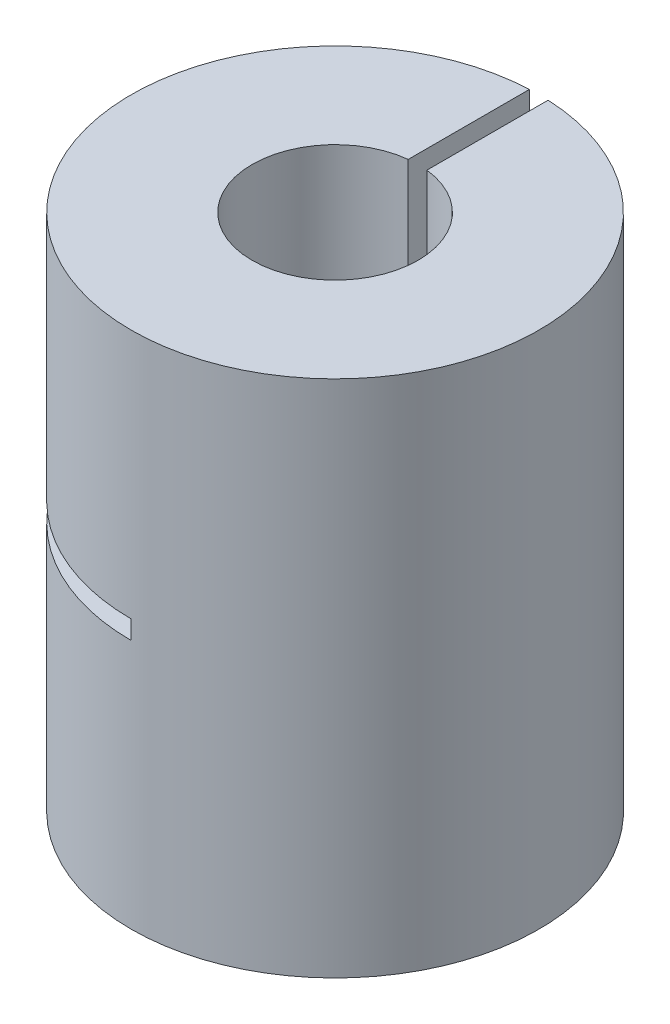
ISO-10303-21;
HEADER;
FILE_DESCRIPTION(('STEP AP214'),'2;1');
FILE_NAME('part.step','',(''),(''),'','','');
FILE_SCHEMA(('AUTOMOTIVE_DESIGN { 1 0 10303 214 1 1 1 1 }'));
ENDSEC;
DATA;
#1=APPLICATION_CONTEXT('core data for automotive mechanical design processes');
#2=APPLICATION_PROTOCOL_DEFINITION('international standard','automotive_design',2000,#1);
#3=PRODUCT_CONTEXT('',#1,'mechanical');
#4=PRODUCT('Part','Part','',(#3));
#5=PRODUCT_RELATED_PRODUCT_CATEGORY('part','',(#4));
#6=PRODUCT_DEFINITION_FORMATION('','',#4);
#7=PRODUCT_DEFINITION_CONTEXT('part definition',#1,'design');
#8=PRODUCT_DEFINITION('design','',#6,#7);
#9=PRODUCT_DEFINITION_SHAPE('','',#8);
#10=(LENGTH_UNIT() NAMED_UNIT(*) SI_UNIT(.MILLI.,.METRE.));
#11=(NAMED_UNIT(*) PLANE_ANGLE_UNIT() SI_UNIT($,.RADIAN.));
#12=(NAMED_UNIT(*) SI_UNIT($,.STERADIAN.) SOLID_ANGLE_UNIT());
#13=UNCERTAINTY_MEASURE_WITH_UNIT(LENGTH_MEASURE(1.E-05),#10,'distance_accuracy_value','');
#14=(GEOMETRIC_REPRESENTATION_CONTEXT(3) GLOBAL_UNCERTAINTY_ASSIGNED_CONTEXT((#13)) GLOBAL_UNIT_ASSIGNED_CONTEXT((#10,
#11,#12)) REPRESENTATION_CONTEXT('',''));
#15=CARTESIAN_POINT('',(0.,0.,0.));
#16=DIRECTION('',(0.,0.,1.));
#17=DIRECTION('',(1.,0.,0.));
#18=AXIS2_PLACEMENT_3D('',#15,#16,#17);
#19=CARTESIAN_POINT('',(0.,25.,0.));
#20=DIRECTION('',(0.,-1.,0.));
#21=DIRECTION('',(0.,0.,-1.));
#22=AXIS2_PLACEMENT_3D('',#19,#20,#21);
#23=CYLINDRICAL_SURFACE('',#22,9.825);
#24=CARTESIAN_POINT('',(0.,25.,0.));
#25=DIRECTION('',(0.,1.,0.));
#26=DIRECTION('',(0.,0.,1.));
#27=AXIS2_PLACEMENT_3D('',#24,#25,#26);
#28=CIRCLE('',#27,9.825);
#29=CARTESIAN_POINT('',(-0.450000000000001,25.,-9.8146892462268));
#30=VERTEX_POINT('',#29);
#31=CARTESIAN_POINT('',(0.450000000000001,25.,-9.8146892462268));
#32=VERTEX_POINT('',#31);
#33=EDGE_CURVE('E127',#30,#32,#28,.T.);
#34=ORIENTED_EDGE('',*,*,#33,.F.);
#35=DIRECTION('',(0.,-1.,0.));
#36=VECTOR('',#35,1.);
#37=CARTESIAN_POINT('',(-0.450000000000001,25.,-9.8146892462268));
#38=LINE('',#37,#36);
#39=CARTESIAN_POINT('',(-0.450000000000001,12.95,-9.8146892462268));
#40=VERTEX_POINT('',#39);
#41=EDGE_CURVE('E110',#30,#40,#38,.T.);
#42=ORIENTED_EDGE('',*,*,#41,.T.);
#43=CARTESIAN_POINT('',(0.,12.95,0.));
#44=DIRECTION('',(0.,1.,0.));
#45=DIRECTION('',(0.,0.,1.));
#46=AXIS2_PLACEMENT_3D('',#43,#44,#45);
#47=CIRCLE('',#46,9.825);
#48=CARTESIAN_POINT('',(0.,12.95,9.825));
#49=VERTEX_POINT('',#48);
#50=EDGE_CURVE('E158',#40,#49,#47,.T.);
#51=ORIENTED_EDGE('',*,*,#50,.T.);
#52=DIRECTION('',(0.,-1.,0.));
#53=VECTOR('',#52,1.);
#54=CARTESIAN_POINT('',(0.,25.,9.825));
#55=LINE('',#54,#53);
#56=CARTESIAN_POINT('',(0.,12.05,9.825));
#57=VERTEX_POINT('',#56);
#58=EDGE_CURVE('E178',#57,#49,#55,.F.);
#59=ORIENTED_EDGE('',*,*,#58,.F.);
#60=CARTESIAN_POINT('',(0.,12.05,0.));
#61=DIRECTION('',(0.,1.,0.));
#62=DIRECTION('',(0.,0.,1.));
#63=AXIS2_PLACEMENT_3D('',#60,#61,#62);
#64=CIRCLE('',#63,9.825);
#65=CARTESIAN_POINT('',(-0.450000000000001,12.05,-9.8146892462268));
#66=VERTEX_POINT('',#65);
#67=EDGE_CURVE('E176',#66,#57,#64,.T.);
#68=ORIENTED_EDGE('',*,*,#67,.F.);
#69=CARTESIAN_POINT('',(-0.45,0.,-9.8146892462268));
#70=VERTEX_POINT('',#69);
#71=EDGE_CURVE('E57',#66,#70,#38,.T.);
#72=ORIENTED_EDGE('',*,*,#71,.T.);
#73=CARTESIAN_POINT('',(0.,0.,0.));
#74=DIRECTION('',(0.,1.,0.));
#75=DIRECTION('',(0.,0.,1.));
#76=AXIS2_PLACEMENT_3D('',#73,#74,#75);
#77=CIRCLE('',#76,9.825);
#78=CARTESIAN_POINT('',(0.45,0.,-9.8146892462268));
#79=VERTEX_POINT('',#78);
#80=EDGE_CURVE('E137',#70,#79,#77,.T.);
#81=ORIENTED_EDGE('',*,*,#80,.T.);
#82=DIRECTION('',(0.,-1.,0.));
#83=VECTOR('',#82,1.);
#84=CARTESIAN_POINT('',(0.450000000000001,25.,-9.8146892462268));
#85=LINE('',#84,#83);
#86=EDGE_CURVE('E135',#79,#32,#85,.F.);
#87=ORIENTED_EDGE('',*,*,#86,.T.);
#88=EDGE_LOOP('',(#34,#42,#51,#59,#68,#72,#81,#87));
#89=FACE_BOUND('',#88,.T.);
#90=ADVANCED_FACE('F36',(#89),#23,.T.);
#91=CARTESIAN_POINT('',(0.,11.5,0.));
#92=DIRECTION('',(0.,1.,0.));
#93=DIRECTION('',(0.,0.,1.));
#94=AXIS2_PLACEMENT_3D('',#91,#92,#93);
#95=CYLINDRICAL_SURFACE('',#94,4.);
#96=CARTESIAN_POINT('',(0.,11.5,0.));
#97=DIRECTION('',(0.,1.,0.));
#98=DIRECTION('',(0.,0.,1.));
#99=AXIS2_PLACEMENT_3D('',#96,#97,#98);
#100=CIRCLE('',#99,4.);
#101=CARTESIAN_POINT('',(-0.45,11.5,-3.97460689880144));
#102=VERTEX_POINT('',#101);
#103=CARTESIAN_POINT('',(0.45,11.5,-3.97460689880144));
#104=VERTEX_POINT('',#103);
#105=EDGE_CURVE('E149',#102,#104,#100,.T.);
#106=ORIENTED_EDGE('',*,*,#105,.F.);
#107=DIRECTION('',(0.,1.,0.));
#108=VECTOR('',#107,1.);
#109=CARTESIAN_POINT('',(-0.45,11.5,-3.97460689880144));
#110=LINE('',#109,#108);
#111=CARTESIAN_POINT('',(-0.450000000000001,12.05,-3.97460689880144));
#112=VERTEX_POINT('',#111);
#113=EDGE_CURVE('E198',#102,#112,#110,.T.);
#114=ORIENTED_EDGE('',*,*,#113,.T.);
#115=CARTESIAN_POINT('',(0.,12.05,0.));
#116=DIRECTION('',(0.,1.,0.));
#117=DIRECTION('',(0.,0.,1.));
#118=AXIS2_PLACEMENT_3D('',#115,#116,#117);
#119=CIRCLE('',#118,4.);
#120=CARTESIAN_POINT('',(0.,12.05,4.));
#121=VERTEX_POINT('',#120);
#122=EDGE_CURVE('E152',#121,#112,#119,.F.);
#123=ORIENTED_EDGE('',*,*,#122,.F.);
#124=DIRECTION('',(0.,1.,0.));
#125=VECTOR('',#124,1.);
#126=CARTESIAN_POINT('',(0.,11.5,4.));
#127=LINE('',#126,#125);
#128=CARTESIAN_POINT('',(0.,12.95,4.));
#129=VERTEX_POINT('',#128);
#130=EDGE_CURVE('E140',#129,#121,#127,.F.);
#131=ORIENTED_EDGE('',*,*,#130,.F.);
#132=CARTESIAN_POINT('',(0.,12.95,0.));
#133=DIRECTION('',(0.,1.,0.));
#134=DIRECTION('',(0.,0.,1.));
#135=AXIS2_PLACEMENT_3D('',#132,#133,#134);
#136=CIRCLE('',#135,4.);
#137=CARTESIAN_POINT('',(-0.450000000000001,12.95,-3.97460689880144));
#138=VERTEX_POINT('',#137);
#139=EDGE_CURVE('E136',#129,#138,#136,.F.);
#140=ORIENTED_EDGE('',*,*,#139,.T.);
#141=CARTESIAN_POINT('',(-0.450000000000001,25.,-3.97460689880144));
#142=VERTEX_POINT('',#141);
#143=EDGE_CURVE('E120',#138,#142,#110,.T.);
#144=ORIENTED_EDGE('',*,*,#143,.T.);
#145=CARTESIAN_POINT('',(0.,25.,0.));
#146=DIRECTION('',(0.,1.,0.));
#147=DIRECTION('',(0.,0.,1.));
#148=AXIS2_PLACEMENT_3D('',#145,#146,#147);
#149=CIRCLE('',#148,4.);
#150=CARTESIAN_POINT('',(0.450000000000001,25.,-3.97460689880144));
#151=VERTEX_POINT('',#150);
#152=EDGE_CURVE('E129',#142,#151,#149,.T.);
#153=ORIENTED_EDGE('',*,*,#152,.T.);
#154=DIRECTION('',(0.,1.,0.));
#155=VECTOR('',#154,1.);
#156=CARTESIAN_POINT('',(0.45,11.5,-3.97460689880144));
#157=LINE('',#156,#155);
#158=EDGE_CURVE('E187',#151,#104,#157,.F.);
#159=ORIENTED_EDGE('',*,*,#158,.T.);
#160=EDGE_LOOP('',(#106,#114,#123,#131,#140,#144,#153,#159));
#161=FACE_BOUND('',#160,.T.);
#162=ADVANCED_FACE('F162',(#161),#95,.F.);
#163=CARTESIAN_POINT('',(0.,25.,0.));
#164=DIRECTION('',(0.,-1.,0.));
#165=DIRECTION('',(0.,0.,-1.));
#166=AXIS2_PLACEMENT_3D('',#163,#164,#165);
#167=CYLINDRICAL_SURFACE('',#166,2.505);
#168=DIRECTION('',(0.,-1.,0.));
#169=VECTOR('',#168,1.);
#170=CARTESIAN_POINT('',(-0.450000000000001,25.,-2.4642493786141));
#171=LINE('',#170,#169);
#172=CARTESIAN_POINT('',(-0.45,11.5,-2.4642493786141));
#173=VERTEX_POINT('',#172);
#174=CARTESIAN_POINT('',(-0.45,0.,-2.46424937861411));
#175=VERTEX_POINT('',#174);
#176=EDGE_CURVE('E195',#173,#175,#171,.T.);
#177=ORIENTED_EDGE('',*,*,#176,.F.);
#178=CARTESIAN_POINT('',(0.,11.5,0.));
#179=DIRECTION('',(0.,1.,0.));
#180=DIRECTION('',(0.,0.,1.));
#181=AXIS2_PLACEMENT_3D('',#178,#179,#180);
#182=CIRCLE('',#181,2.505);
#183=CARTESIAN_POINT('',(0.45,11.5,-2.4642493786141));
#184=VERTEX_POINT('',#183);
#185=EDGE_CURVE('E147',#173,#184,#182,.T.);
#186=ORIENTED_EDGE('',*,*,#185,.T.);
#187=DIRECTION('',(0.,-1.,0.));
#188=VECTOR('',#187,1.);
#189=CARTESIAN_POINT('',(0.450000000000001,25.,-2.4642493786141));
#190=LINE('',#189,#188);
#191=CARTESIAN_POINT('',(0.45,0.,-2.46424937861411));
#192=VERTEX_POINT('',#191);
#193=EDGE_CURVE('E49',#192,#184,#190,.F.);
#194=ORIENTED_EDGE('',*,*,#193,.F.);
#195=CARTESIAN_POINT('',(0.,0.,0.));
#196=DIRECTION('',(0.,1.,0.));
#197=DIRECTION('',(0.,0.,1.));
#198=AXIS2_PLACEMENT_3D('',#195,#196,#197);
#199=CIRCLE('',#198,2.505);
#200=EDGE_CURVE('E142',#175,#192,#199,.T.);
#201=ORIENTED_EDGE('',*,*,#200,.F.);
#202=EDGE_LOOP('',(#177,#186,#194,#201));
#203=FACE_BOUND('',#202,.T.);
#204=ADVANCED_FACE('F214',(#203),#167,.F.);
#205=CARTESIAN_POINT('',(0.,25.,0.));
#206=DIRECTION('',(0.,1.,0.));
#207=DIRECTION('',(0.,0.,1.));
#208=AXIS2_PLACEMENT_3D('',#205,#206,#207);
#209=PLANE('',#208);
#210=DIRECTION('',(0.,0.,1.));
#211=VECTOR('',#210,1.);
#212=CARTESIAN_POINT('',(-0.450000000000001,25.,-13.5));
#213=LINE('',#212,#211);
#214=EDGE_CURVE('E113',#30,#142,#213,.T.);
#215=ORIENTED_EDGE('',*,*,#214,.F.);
#216=ORIENTED_EDGE('',*,*,#33,.T.);
#217=DIRECTION('',(0.,0.,1.));
#218=VECTOR('',#217,1.);
#219=CARTESIAN_POINT('',(0.450000000000001,25.,-13.5));
#220=LINE('',#219,#218);
#221=EDGE_CURVE('E131',#32,#151,#220,.T.);
#222=ORIENTED_EDGE('',*,*,#221,.T.);
#223=ORIENTED_EDGE('',*,*,#152,.F.);
#224=EDGE_LOOP('',(#215,#216,#222,#223));
#225=FACE_BOUND('',#224,.T.);
#226=ADVANCED_FACE('F125',(#225),#209,.T.);
#227=CARTESIAN_POINT('',(0.,0.,0.));
#228=DIRECTION('',(0.,1.,0.));
#229=DIRECTION('',(0.,0.,1.));
#230=AXIS2_PLACEMENT_3D('',#227,#228,#229);
#231=PLANE('',#230);
#232=ORIENTED_EDGE('',*,*,#80,.F.);
#233=DIRECTION('',(0.,0.,1.));
#234=VECTOR('',#233,1.);
#235=CARTESIAN_POINT('',(-0.45,0.,-13.5));
#236=LINE('',#235,#234);
#237=EDGE_CURVE('E130',#70,#175,#236,.T.);
#238=ORIENTED_EDGE('',*,*,#237,.T.);
#239=ORIENTED_EDGE('',*,*,#200,.T.);
#240=DIRECTION('',(0.,0.,1.));
#241=VECTOR('',#240,1.);
#242=CARTESIAN_POINT('',(0.45,0.,-13.5));
#243=LINE('',#242,#241);
#244=EDGE_CURVE('E203',#79,#192,#243,.T.);
#245=ORIENTED_EDGE('',*,*,#244,.F.);
#246=EDGE_LOOP('',(#232,#238,#239,#245));
#247=FACE_BOUND('',#246,.T.);
#248=ADVANCED_FACE('F211',(#247),#231,.F.);
#249=CARTESIAN_POINT('',(0.,11.5,0.));
#250=DIRECTION('',(0.,1.,0.));
#251=DIRECTION('',(0.,0.,1.));
#252=AXIS2_PLACEMENT_3D('',#249,#250,#251);
#253=PLANE('',#252);
#254=DIRECTION('',(0.,0.,1.));
#255=VECTOR('',#254,1.);
#256=CARTESIAN_POINT('',(-0.45,11.5,0.));
#257=LINE('',#256,#255);
#258=EDGE_CURVE('E193',#102,#173,#257,.T.);
#259=ORIENTED_EDGE('',*,*,#258,.F.);
#260=ORIENTED_EDGE('',*,*,#105,.T.);
#261=DIRECTION('',(0.,0.,-1.));
#262=VECTOR('',#261,1.);
#263=CARTESIAN_POINT('',(0.45,11.5,0.));
#264=LINE('',#263,#262);
#265=EDGE_CURVE('E11',#184,#104,#264,.T.);
#266=ORIENTED_EDGE('',*,*,#265,.F.);
#267=ORIENTED_EDGE('',*,*,#185,.F.);
#268=EDGE_LOOP('',(#259,#260,#266,#267));
#269=FACE_BOUND('',#268,.T.);
#270=ADVANCED_FACE('F191',(#269),#253,.T.);
#271=CARTESIAN_POINT('',(-9.825,12.05,13.5));
#272=DIRECTION('',(0.,1.,0.));
#273=DIRECTION('',(0.,0.,1.));
#274=AXIS2_PLACEMENT_3D('',#271,#272,#273);
#275=PLANE('',#274);
#276=DIRECTION('',(0.,0.,1.));
#277=VECTOR('',#276,1.);
#278=CARTESIAN_POINT('',(-0.450000000000001,12.05,13.5));
#279=LINE('',#278,#277);
#280=EDGE_CURVE('E119',#66,#112,#279,.T.);
#281=ORIENTED_EDGE('',*,*,#280,.F.);
#282=ORIENTED_EDGE('',*,*,#67,.T.);
#283=DIRECTION('',(0.,0.,-1.));
#284=VECTOR('',#283,1.);
#285=CARTESIAN_POINT('',(0.,12.05,13.5));
#286=LINE('',#285,#284);
#287=EDGE_CURVE('E170',#57,#121,#286,.T.);
#288=ORIENTED_EDGE('',*,*,#287,.T.);
#289=ORIENTED_EDGE('',*,*,#122,.T.);
#290=EDGE_LOOP('',(#281,#282,#288,#289));
#291=FACE_BOUND('',#290,.T.);
#292=ADVANCED_FACE('F174',(#291),#275,.T.);
#293=CARTESIAN_POINT('',(0.,12.5,13.5));
#294=DIRECTION('',(-1.,0.,0.));
#295=DIRECTION('',(0.,0.,1.));
#296=AXIS2_PLACEMENT_3D('',#293,#294,#295);
#297=PLANE('',#296);
#298=ORIENTED_EDGE('',*,*,#58,.T.);
#299=DIRECTION('',(0.,0.,-1.));
#300=VECTOR('',#299,1.);
#301=CARTESIAN_POINT('',(0.,12.95,13.5));
#302=LINE('',#301,#300);
#303=EDGE_CURVE('E172',#49,#129,#302,.T.);
#304=ORIENTED_EDGE('',*,*,#303,.T.);
#305=ORIENTED_EDGE('',*,*,#130,.T.);
#306=ORIENTED_EDGE('',*,*,#287,.F.);
#307=EDGE_LOOP('',(#298,#304,#305,#306));
#308=FACE_BOUND('',#307,.T.);
#309=ADVANCED_FACE('F169',(#308),#297,.T.);
#310=CARTESIAN_POINT('',(-9.825,12.95,13.5));
#311=DIRECTION('',(0.,1.,0.));
#312=DIRECTION('',(0.,0.,1.));
#313=AXIS2_PLACEMENT_3D('',#310,#311,#312);
#314=PLANE('',#313);
#315=ORIENTED_EDGE('',*,*,#50,.F.);
#316=DIRECTION('',(0.,0.,1.));
#317=VECTOR('',#316,1.);
#318=CARTESIAN_POINT('',(-0.450000000000001,12.95,13.5));
#319=LINE('',#318,#317);
#320=EDGE_CURVE('E43',#40,#138,#319,.T.);
#321=ORIENTED_EDGE('',*,*,#320,.T.);
#322=ORIENTED_EDGE('',*,*,#139,.F.);
#323=ORIENTED_EDGE('',*,*,#303,.F.);
#324=EDGE_LOOP('',(#315,#321,#322,#323));
#325=FACE_BOUND('',#324,.T.);
#326=ADVANCED_FACE('F155',(#325),#314,.F.);
#327=CARTESIAN_POINT('',(-0.45,0.,-13.5));
#328=DIRECTION('',(-1.,0.,0.));
#329=DIRECTION('',(0.,-1.,0.));
#330=AXIS2_PLACEMENT_3D('',#327,#328,#329);
#331=PLANE('',#330);
#332=ORIENTED_EDGE('',*,*,#214,.T.);
#333=ORIENTED_EDGE('',*,*,#143,.F.);
#334=ORIENTED_EDGE('',*,*,#320,.F.);
#335=ORIENTED_EDGE('',*,*,#41,.F.);
#336=EDGE_LOOP('',(#332,#333,#334,#335));
#337=FACE_BOUND('',#336,.T.);
#338=ADVANCED_FACE('F112',(#337),#331,.F.);
#339=ORIENTED_EDGE('',*,*,#176,.T.);
#340=ORIENTED_EDGE('',*,*,#237,.F.);
#341=ORIENTED_EDGE('',*,*,#71,.F.);
#342=ORIENTED_EDGE('',*,*,#280,.T.);
#343=ORIENTED_EDGE('',*,*,#113,.F.);
#344=ORIENTED_EDGE('',*,*,#258,.T.);
#345=EDGE_LOOP('',(#339,#340,#341,#342,#343,#344));
#346=FACE_BOUND('',#345,.T.);
#347=ADVANCED_FACE('F215',(#346),#331,.F.);
#348=CARTESIAN_POINT('',(0.45,0.,-13.5));
#349=DIRECTION('',(1.,0.,0.));
#350=DIRECTION('',(0.,1.,0.));
#351=AXIS2_PLACEMENT_3D('',#348,#349,#350);
#352=PLANE('',#351);
#353=ORIENTED_EDGE('',*,*,#244,.T.);
#354=ORIENTED_EDGE('',*,*,#193,.T.);
#355=ORIENTED_EDGE('',*,*,#265,.T.);
#356=ORIENTED_EDGE('',*,*,#158,.F.);
#357=ORIENTED_EDGE('',*,*,#221,.F.);
#358=ORIENTED_EDGE('',*,*,#86,.F.);
#359=EDGE_LOOP('',(#353,#354,#355,#356,#357,#358));
#360=FACE_BOUND('',#359,.T.);
#361=ADVANCED_FACE('F217',(#360),#352,.F.);
#362=CLOSED_SHELL('',(#90,#162,#204,#226,#248,#270,#292,#309,#326,#338,#347,#361));
#363=MANIFOLD_SOLID_BREP('B2',#362);
#364=ADVANCED_BREP_SHAPE_REPRESENTATION('',(#18,#363),#14);
#365=SHAPE_DEFINITION_REPRESENTATION(#9,#364);
ENDSEC;
END-ISO-10303-21;
